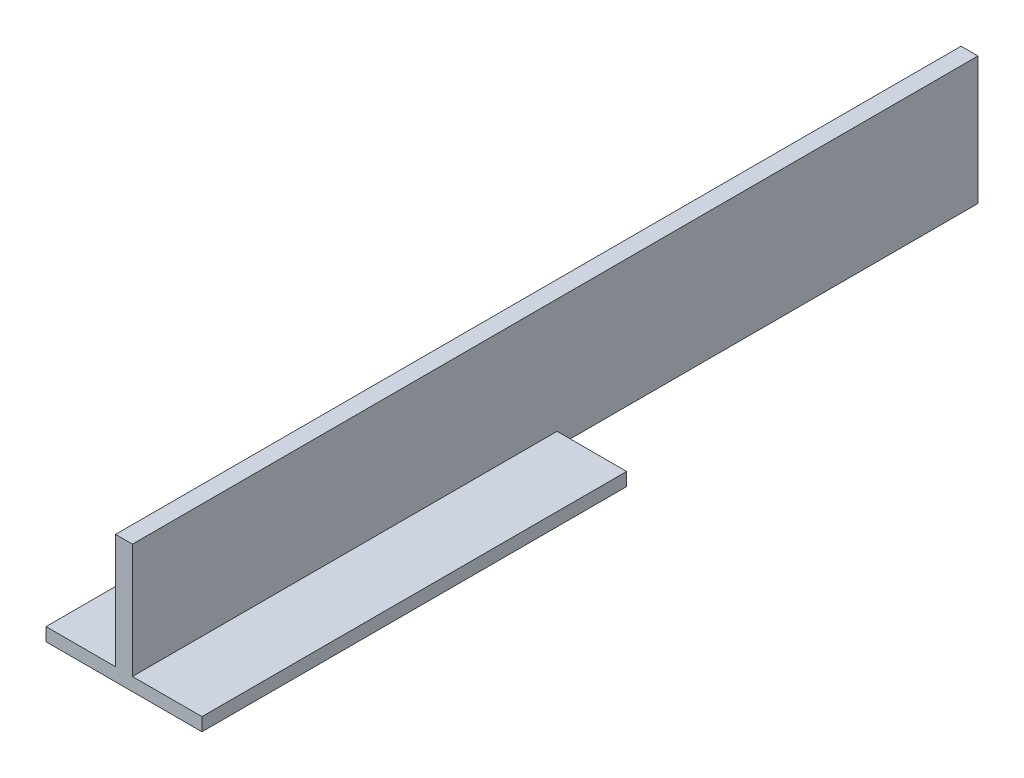
ISO-10303-21;
HEADER;
FILE_DESCRIPTION(('STEP AP214'),'2;1');
FILE_NAME('part.step','',(''),(''),'','','');
FILE_SCHEMA(('AUTOMOTIVE_DESIGN { 1 0 10303 214 1 1 1 1 }'));
ENDSEC;
DATA;
#1=APPLICATION_CONTEXT('core data for automotive mechanical design processes');
#2=APPLICATION_PROTOCOL_DEFINITION('international standard','automotive_design',2000,#1);
#3=PRODUCT_CONTEXT('',#1,'mechanical');
#4=PRODUCT('Part','Part','',(#3));
#5=PRODUCT_RELATED_PRODUCT_CATEGORY('part','',(#4));
#6=PRODUCT_DEFINITION_FORMATION('','',#4);
#7=PRODUCT_DEFINITION_CONTEXT('part definition',#1,'design');
#8=PRODUCT_DEFINITION('design','',#6,#7);
#9=PRODUCT_DEFINITION_SHAPE('','',#8);
#10=(LENGTH_UNIT() NAMED_UNIT(*) SI_UNIT(.MILLI.,.METRE.));
#11=(NAMED_UNIT(*) PLANE_ANGLE_UNIT() SI_UNIT($,.RADIAN.));
#12=(NAMED_UNIT(*) SI_UNIT($,.STERADIAN.) SOLID_ANGLE_UNIT());
#13=UNCERTAINTY_MEASURE_WITH_UNIT(LENGTH_MEASURE(1.E-05),#10,'distance_accuracy_value','');
#14=(GEOMETRIC_REPRESENTATION_CONTEXT(3) GLOBAL_UNCERTAINTY_ASSIGNED_CONTEXT((#13)) GLOBAL_UNIT_ASSIGNED_CONTEXT((#10,
#11,#12)) REPRESENTATION_CONTEXT('',''));
#15=CARTESIAN_POINT('',(0.,0.,0.));
#16=DIRECTION('',(0.,0.,1.));
#17=DIRECTION('',(1.,0.,0.));
#18=AXIS2_PLACEMENT_3D('',#15,#16,#17);
#19=CARTESIAN_POINT('',(0.,7.,450.));
#20=DIRECTION('',(1.,0.,0.));
#21=DIRECTION('',(0.,0.,-1.));
#22=AXIS2_PLACEMENT_3D('',#19,#20,#21);
#23=PLANE('',#22);
#24=DIRECTION('',(0.,-1.,0.));
#25=VECTOR('',#24,1.);
#26=CARTESIAN_POINT('',(0.,7.,0.));
#27=LINE('',#26,#25);
#28=CARTESIAN_POINT('',(0.,7.,0.));
#29=VERTEX_POINT('',#28);
#30=CARTESIAN_POINT('',(0.,0.,0.));
#31=VERTEX_POINT('',#30);
#32=EDGE_CURVE('E128',#29,#31,#27,.T.);
#33=ORIENTED_EDGE('',*,*,#32,.T.);
#34=DIRECTION('',(0.,0.,-1.));
#35=VECTOR('',#34,1.);
#36=CARTESIAN_POINT('',(0.,0.,450.));
#37=LINE('',#36,#35);
#38=CARTESIAN_POINT('',(0.,0.,450.));
#39=VERTEX_POINT('',#38);
#40=EDGE_CURVE('E11',#39,#31,#37,.T.);
#41=ORIENTED_EDGE('',*,*,#40,.F.);
#42=DIRECTION('',(0.,-1.,0.));
#43=VECTOR('',#42,1.);
#44=CARTESIAN_POINT('',(0.,7.,450.));
#45=LINE('',#44,#43);
#46=CARTESIAN_POINT('',(0.,7.,450.));
#47=VERTEX_POINT('',#46);
#48=EDGE_CURVE('E140',#47,#39,#45,.T.);
#49=ORIENTED_EDGE('',*,*,#48,.F.);
#50=DIRECTION('',(0.,0.,-1.));
#51=VECTOR('',#50,1.);
#52=CARTESIAN_POINT('',(0.,7.,450.));
#53=LINE('',#52,#51);
#54=EDGE_CURVE('E124',#47,#29,#53,.T.);
#55=ORIENTED_EDGE('',*,*,#54,.T.);
#56=EDGE_LOOP('',(#33,#41,#49,#55));
#57=FACE_BOUND('',#56,.T.);
#58=ADVANCED_FACE('F32',(#57),#23,.F.);
#59=CARTESIAN_POINT('',(0.,0.,450.));
#60=DIRECTION('',(0.,1.,0.));
#61=DIRECTION('',(0.,0.,1.));
#62=AXIS2_PLACEMENT_3D('',#59,#60,#61);
#63=PLANE('',#62);
#64=DIRECTION('',(0.,0.,1.));
#65=VECTOR('',#64,1.);
#66=CARTESIAN_POINT('',(46.,0.,0.));
#67=LINE('',#66,#65);
#68=CARTESIAN_POINT('',(46.,0.,0.));
#69=VERTEX_POINT('',#68);
#70=CARTESIAN_POINT('',(46.,0.,224.));
#71=VERTEX_POINT('',#70);
#72=EDGE_CURVE('E164',#69,#71,#67,.T.);
#73=ORIENTED_EDGE('',*,*,#72,.T.);
#74=DIRECTION('',(1.,0.,0.));
#75=VECTOR('',#74,1.);
#76=CARTESIAN_POINT('',(83.,0.,224.));
#77=LINE('',#76,#75);
#78=CARTESIAN_POINT('',(83.,0.,224.));
#79=VERTEX_POINT('',#78);
#80=EDGE_CURVE('E163',#71,#79,#77,.T.);
#81=ORIENTED_EDGE('',*,*,#80,.T.);
#82=DIRECTION('',(0.,0.,-1.));
#83=VECTOR('',#82,1.);
#84=CARTESIAN_POINT('',(83.,0.,450.));
#85=LINE('',#84,#83);
#86=CARTESIAN_POINT('',(83.,0.,450.));
#87=VERTEX_POINT('',#86);
#88=EDGE_CURVE('E39',#87,#79,#85,.T.);
#89=ORIENTED_EDGE('',*,*,#88,.F.);
#90=DIRECTION('',(1.,0.,0.));
#91=VECTOR('',#90,1.);
#92=CARTESIAN_POINT('',(0.,0.,450.));
#93=LINE('',#92,#91);
#94=EDGE_CURVE('E85',#39,#87,#93,.T.);
#95=ORIENTED_EDGE('',*,*,#94,.F.);
#96=ORIENTED_EDGE('',*,*,#40,.T.);
#97=DIRECTION('',(1.,0.,0.));
#98=VECTOR('',#97,1.);
#99=CARTESIAN_POINT('',(0.,0.,0.));
#100=LINE('',#99,#98);
#101=EDGE_CURVE('E131',#31,#69,#100,.T.);
#102=ORIENTED_EDGE('',*,*,#101,.T.);
#103=EDGE_LOOP('',(#73,#81,#89,#95,#96,#102));
#104=FACE_BOUND('',#103,.T.);
#105=ADVANCED_FACE('F161',(#104),#63,.F.);
#106=CARTESIAN_POINT('',(83.,0.,450.));
#107=DIRECTION('',(-1.,0.,0.));
#108=DIRECTION('',(0.,0.,1.));
#109=AXIS2_PLACEMENT_3D('',#106,#107,#108);
#110=PLANE('',#109);
#111=ORIENTED_EDGE('',*,*,#88,.T.);
#112=DIRECTION('',(0.,1.,0.));
#113=VECTOR('',#112,1.);
#114=CARTESIAN_POINT('',(83.,0.,224.));
#115=LINE('',#114,#113);
#116=CARTESIAN_POINT('',(83.,7.,224.));
#117=VERTEX_POINT('',#116);
#118=EDGE_CURVE('E132',#79,#117,#115,.T.);
#119=ORIENTED_EDGE('',*,*,#118,.T.);
#120=DIRECTION('',(0.,0.,-1.));
#121=VECTOR('',#120,1.);
#122=CARTESIAN_POINT('',(83.,7.,450.));
#123=LINE('',#122,#121);
#124=CARTESIAN_POINT('',(83.,7.,450.));
#125=VERTEX_POINT('',#124);
#126=EDGE_CURVE('E147',#125,#117,#123,.T.);
#127=ORIENTED_EDGE('',*,*,#126,.F.);
#128=DIRECTION('',(0.,1.,0.));
#129=VECTOR('',#128,1.);
#130=CARTESIAN_POINT('',(83.,0.,450.));
#131=LINE('',#130,#129);
#132=EDGE_CURVE('E156',#87,#125,#131,.T.);
#133=ORIENTED_EDGE('',*,*,#132,.F.);
#134=EDGE_LOOP('',(#111,#119,#127,#133));
#135=FACE_BOUND('',#134,.T.);
#136=ADVANCED_FACE('F153',(#135),#110,.F.);
#137=CARTESIAN_POINT('',(83.,7.,450.));
#138=DIRECTION('',(0.,-1.,0.));
#139=DIRECTION('',(0.,0.,-1.));
#140=AXIS2_PLACEMENT_3D('',#137,#138,#139);
#141=PLANE('',#140);
#142=ORIENTED_EDGE('',*,*,#126,.T.);
#143=DIRECTION('',(1.,0.,0.));
#144=VECTOR('',#143,1.);
#145=CARTESIAN_POINT('',(83.,7.,224.));
#146=LINE('',#145,#144);
#147=CARTESIAN_POINT('',(46.,7.,224.));
#148=VERTEX_POINT('',#147);
#149=EDGE_CURVE('E170',#148,#117,#146,.T.);
#150=ORIENTED_EDGE('',*,*,#149,.F.);
#151=DIRECTION('',(0.,0.,-1.));
#152=VECTOR('',#151,1.);
#153=CARTESIAN_POINT('',(46.,7.,450.));
#154=LINE('',#153,#152);
#155=CARTESIAN_POINT('',(46.,7.,450.));
#156=VERTEX_POINT('',#155);
#157=EDGE_CURVE('E144',#156,#148,#154,.T.);
#158=ORIENTED_EDGE('',*,*,#157,.F.);
#159=DIRECTION('',(-1.,0.,0.));
#160=VECTOR('',#159,1.);
#161=CARTESIAN_POINT('',(83.,7.,450.));
#162=LINE('',#161,#160);
#163=EDGE_CURVE('E179',#125,#156,#162,.T.);
#164=ORIENTED_EDGE('',*,*,#163,.F.);
#165=EDGE_LOOP('',(#142,#150,#158,#164));
#166=FACE_BOUND('',#165,.T.);
#167=ADVANCED_FACE('F184',(#166),#141,.F.);
#168=CARTESIAN_POINT('',(46.,7.,450.));
#169=DIRECTION('',(-1.,0.,0.));
#170=DIRECTION('',(0.,-1.,0.));
#171=AXIS2_PLACEMENT_3D('',#168,#169,#170);
#172=PLANE('',#171);
#173=DIRECTION('',(0.,1.,0.));
#174=VECTOR('',#173,1.);
#175=CARTESIAN_POINT('',(46.,7.,0.));
#176=LINE('',#175,#174);
#177=CARTESIAN_POINT('',(46.,68.,0.));
#178=VERTEX_POINT('',#177);
#179=EDGE_CURVE('E46',#69,#178,#176,.T.);
#180=ORIENTED_EDGE('',*,*,#179,.T.);
#181=DIRECTION('',(0.,0.,-1.));
#182=VECTOR('',#181,1.);
#183=CARTESIAN_POINT('',(46.,68.,450.));
#184=LINE('',#183,#182);
#185=CARTESIAN_POINT('',(46.,68.,450.));
#186=VERTEX_POINT('',#185);
#187=EDGE_CURVE('E119',#186,#178,#184,.T.);
#188=ORIENTED_EDGE('',*,*,#187,.F.);
#189=DIRECTION('',(0.,1.,0.));
#190=VECTOR('',#189,1.);
#191=CARTESIAN_POINT('',(46.,7.,450.));
#192=LINE('',#191,#190);
#193=EDGE_CURVE('E108',#156,#186,#192,.T.);
#194=ORIENTED_EDGE('',*,*,#193,.F.);
#195=ORIENTED_EDGE('',*,*,#157,.T.);
#196=DIRECTION('',(0.,1.,0.));
#197=VECTOR('',#196,1.);
#198=CARTESIAN_POINT('',(46.,0.,224.));
#199=LINE('',#198,#197);
#200=EDGE_CURVE('E167',#71,#148,#199,.T.);
#201=ORIENTED_EDGE('',*,*,#200,.F.);
#202=ORIENTED_EDGE('',*,*,#72,.F.);
#203=EDGE_LOOP('',(#180,#188,#194,#195,#201,#202));
#204=FACE_BOUND('',#203,.T.);
#205=ADVANCED_FACE('F188',(#204),#172,.F.);
#206=CARTESIAN_POINT('',(46.,68.,450.));
#207=DIRECTION('',(0.,-1.,0.));
#208=DIRECTION('',(0.,0.,-1.));
#209=AXIS2_PLACEMENT_3D('',#206,#207,#208);
#210=PLANE('',#209);
#211=DIRECTION('',(-1.,0.,0.));
#212=VECTOR('',#211,1.);
#213=CARTESIAN_POINT('',(46.,68.,0.));
#214=LINE('',#213,#212);
#215=CARTESIAN_POINT('',(37.,68.,0.));
#216=VERTEX_POINT('',#215);
#217=EDGE_CURVE('E116',#178,#216,#214,.T.);
#218=ORIENTED_EDGE('',*,*,#217,.T.);
#219=DIRECTION('',(0.,0.,-1.));
#220=VECTOR('',#219,1.);
#221=CARTESIAN_POINT('',(37.,68.,450.));
#222=LINE('',#221,#220);
#223=CARTESIAN_POINT('',(37.,68.,450.));
#224=VERTEX_POINT('',#223);
#225=EDGE_CURVE('E114',#224,#216,#222,.T.);
#226=ORIENTED_EDGE('',*,*,#225,.F.);
#227=DIRECTION('',(-1.,0.,0.));
#228=VECTOR('',#227,1.);
#229=CARTESIAN_POINT('',(46.,68.,450.));
#230=LINE('',#229,#228);
#231=EDGE_CURVE('E101',#186,#224,#230,.T.);
#232=ORIENTED_EDGE('',*,*,#231,.F.);
#233=ORIENTED_EDGE('',*,*,#187,.T.);
#234=EDGE_LOOP('',(#218,#226,#232,#233));
#235=FACE_BOUND('',#234,.T.);
#236=ADVANCED_FACE('F115',(#235),#210,.F.);
#237=CARTESIAN_POINT('',(37.,68.,450.));
#238=DIRECTION('',(1.,0.,0.));
#239=DIRECTION('',(0.,0.,-1.));
#240=AXIS2_PLACEMENT_3D('',#237,#238,#239);
#241=PLANE('',#240);
#242=DIRECTION('',(0.,-1.,0.));
#243=VECTOR('',#242,1.);
#244=CARTESIAN_POINT('',(37.,68.,0.));
#245=LINE('',#244,#243);
#246=CARTESIAN_POINT('',(37.,7.,0.));
#247=VERTEX_POINT('',#246);
#248=EDGE_CURVE('E137',#216,#247,#245,.T.);
#249=ORIENTED_EDGE('',*,*,#248,.T.);
#250=DIRECTION('',(0.,0.,-1.));
#251=VECTOR('',#250,1.);
#252=CARTESIAN_POINT('',(37.,7.,450.));
#253=LINE('',#252,#251);
#254=CARTESIAN_POINT('',(37.,7.,450.));
#255=VERTEX_POINT('',#254);
#256=EDGE_CURVE('E120',#255,#247,#253,.T.);
#257=ORIENTED_EDGE('',*,*,#256,.F.);
#258=DIRECTION('',(0.,-1.,0.));
#259=VECTOR('',#258,1.);
#260=CARTESIAN_POINT('',(37.,68.,450.));
#261=LINE('',#260,#259);
#262=EDGE_CURVE('E105',#224,#255,#261,.T.);
#263=ORIENTED_EDGE('',*,*,#262,.F.);
#264=ORIENTED_EDGE('',*,*,#225,.T.);
#265=EDGE_LOOP('',(#249,#257,#263,#264));
#266=FACE_BOUND('',#265,.T.);
#267=ADVANCED_FACE('F122',(#266),#241,.F.);
#268=CARTESIAN_POINT('',(37.,7.,450.));
#269=DIRECTION('',(0.,-1.,0.));
#270=DIRECTION('',(1.,0.,0.));
#271=AXIS2_PLACEMENT_3D('',#268,#269,#270);
#272=PLANE('',#271);
#273=DIRECTION('',(-1.,0.,0.));
#274=VECTOR('',#273,1.);
#275=CARTESIAN_POINT('',(37.,7.,0.));
#276=LINE('',#275,#274);
#277=EDGE_CURVE('E77',#247,#29,#276,.T.);
#278=ORIENTED_EDGE('',*,*,#277,.T.);
#279=ORIENTED_EDGE('',*,*,#54,.F.);
#280=DIRECTION('',(-1.,0.,0.));
#281=VECTOR('',#280,1.);
#282=CARTESIAN_POINT('',(37.,7.,450.));
#283=LINE('',#282,#281);
#284=EDGE_CURVE('E55',#255,#47,#283,.T.);
#285=ORIENTED_EDGE('',*,*,#284,.F.);
#286=ORIENTED_EDGE('',*,*,#256,.T.);
#287=EDGE_LOOP('',(#278,#279,#285,#286));
#288=FACE_BOUND('',#287,.T.);
#289=ADVANCED_FACE('F191',(#288),#272,.F.);
#290=CARTESIAN_POINT('',(0.,0.,450.));
#291=DIRECTION('',(0.,0.,1.));
#292=DIRECTION('',(1.,0.,0.));
#293=AXIS2_PLACEMENT_3D('',#290,#291,#292);
#294=PLANE('',#293);
#295=ORIENTED_EDGE('',*,*,#48,.T.);
#296=ORIENTED_EDGE('',*,*,#94,.T.);
#297=ORIENTED_EDGE('',*,*,#132,.T.);
#298=ORIENTED_EDGE('',*,*,#163,.T.);
#299=ORIENTED_EDGE('',*,*,#193,.T.);
#300=ORIENTED_EDGE('',*,*,#231,.T.);
#301=ORIENTED_EDGE('',*,*,#262,.T.);
#302=ORIENTED_EDGE('',*,*,#284,.T.);
#303=EDGE_LOOP('',(#295,#296,#297,#298,#299,#300,#301,#302));
#304=FACE_BOUND('',#303,.T.);
#305=ADVANCED_FACE('F103',(#304),#294,.T.);
#306=CARTESIAN_POINT('',(0.,0.,0.));
#307=DIRECTION('',(0.,0.,1.));
#308=DIRECTION('',(1.,0.,0.));
#309=AXIS2_PLACEMENT_3D('',#306,#307,#308);
#310=PLANE('',#309);
#311=ORIENTED_EDGE('',*,*,#179,.F.);
#312=ORIENTED_EDGE('',*,*,#101,.F.);
#313=ORIENTED_EDGE('',*,*,#32,.F.);
#314=ORIENTED_EDGE('',*,*,#277,.F.);
#315=ORIENTED_EDGE('',*,*,#248,.F.);
#316=ORIENTED_EDGE('',*,*,#217,.F.);
#317=EDGE_LOOP('',(#311,#312,#313,#314,#315,#316));
#318=FACE_BOUND('',#317,.T.);
#319=ADVANCED_FACE('F189',(#318),#310,.F.);
#320=CARTESIAN_POINT('',(83.,0.,224.));
#321=DIRECTION('',(0.,0.,1.));
#322=DIRECTION('',(1.,0.,0.));
#323=AXIS2_PLACEMENT_3D('',#320,#321,#322);
#324=PLANE('',#323);
#325=ORIENTED_EDGE('',*,*,#149,.T.);
#326=ORIENTED_EDGE('',*,*,#118,.F.);
#327=ORIENTED_EDGE('',*,*,#80,.F.);
#328=ORIENTED_EDGE('',*,*,#200,.T.);
#329=EDGE_LOOP('',(#325,#326,#327,#328));
#330=FACE_BOUND('',#329,.T.);
#331=ADVANCED_FACE('F216',(#330),#324,.F.);
#332=CLOSED_SHELL('',(#58,#105,#136,#167,#205,#236,#267,#289,#305,#319,#331));
#333=MANIFOLD_SOLID_BREP('B2',#332);
#334=ADVANCED_BREP_SHAPE_REPRESENTATION('',(#18,#333),#14);
#335=SHAPE_DEFINITION_REPRESENTATION(#9,#334);
ENDSEC;
END-ISO-10303-21;
